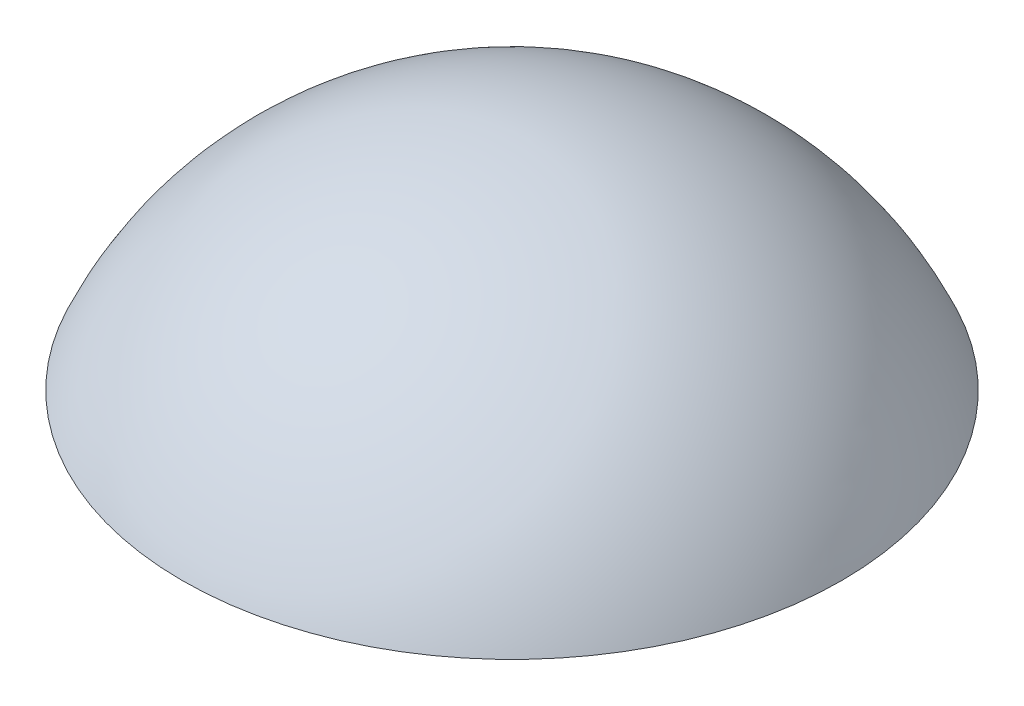
ISO-10303-21;
HEADER;
FILE_DESCRIPTION(('STEP AP214'),'2;1');
FILE_NAME('part.step','',(''),(''),'','','');
FILE_SCHEMA(('AUTOMOTIVE_DESIGN { 1 0 10303 214 1 1 1 1 }'));
ENDSEC;
DATA;
#1=APPLICATION_CONTEXT('core data for automotive mechanical design processes');
#2=APPLICATION_PROTOCOL_DEFINITION('international standard','automotive_design',2000,#1);
#3=PRODUCT_CONTEXT('',#1,'mechanical');
#4=PRODUCT('Part','Part','',(#3));
#5=PRODUCT_RELATED_PRODUCT_CATEGORY('part','',(#4));
#6=PRODUCT_DEFINITION_FORMATION('','',#4);
#7=PRODUCT_DEFINITION_CONTEXT('part definition',#1,'design');
#8=PRODUCT_DEFINITION('design','',#6,#7);
#9=PRODUCT_DEFINITION_SHAPE('','',#8);
#10=(LENGTH_UNIT() NAMED_UNIT(*) SI_UNIT(.MILLI.,.METRE.));
#11=(NAMED_UNIT(*) PLANE_ANGLE_UNIT() SI_UNIT($,.RADIAN.));
#12=(NAMED_UNIT(*) SI_UNIT($,.STERADIAN.) SOLID_ANGLE_UNIT());
#13=UNCERTAINTY_MEASURE_WITH_UNIT(LENGTH_MEASURE(1.E-05),#10,'distance_accuracy_value','');
#14=(GEOMETRIC_REPRESENTATION_CONTEXT(3) GLOBAL_UNCERTAINTY_ASSIGNED_CONTEXT((#13)) GLOBAL_UNIT_ASSIGNED_CONTEXT((#10,
#11,#12)) REPRESENTATION_CONTEXT('',''));
#15=CARTESIAN_POINT('',(0.,0.,0.));
#16=DIRECTION('',(0.,0.,1.));
#17=DIRECTION('',(1.,0.,0.));
#18=AXIS2_PLACEMENT_3D('',#15,#16,#17);
#19=CARTESIAN_POINT('',(54.1726868098907,-2.84304259014334,0.));
#20=DIRECTION('',(0.,1.,0.));
#21=DIRECTION('',(0.,0.,1.));
#22=AXIS2_PLACEMENT_3D('',#19,#20,#21);
#23=CONICAL_SURFACE('',#22,51.4725104006158,0.539621947760102);
#24=CARTESIAN_POINT('',(54.1726868098907,-2.84304259014334,0.));
#25=DIRECTION('',(0.,-1.,0.));
#26=DIRECTION('',(0.,0.,-1.));
#27=AXIS2_PLACEMENT_3D('',#24,#25,#26);
#28=CIRCLE('',#27,51.4725104006158);
#29=CARTESIAN_POINT('',(54.1726868098907,-2.84304259014334,-51.4725104006158));
#30=VERTEX_POINT('',#29);
#31=EDGE_CURVE('E71',#30,#30,#28,.T.);
#32=ORIENTED_EDGE('',*,*,#31,.T.);
#33=EDGE_LOOP('',(#32));
#34=FACE_BOUND('',#33,.T.);
#35=CARTESIAN_POINT('',(54.1726868098907,-17.3572088768475,0.));
#36=DIRECTION('',(0.,-1.,0.));
#37=DIRECTION('',(0.,0.,-1.));
#38=AXIS2_PLACEMENT_3D('',#35,#36,#37);
#39=CIRCLE('',#38,42.7797462032344);
#40=CARTESIAN_POINT('',(54.1726868098907,-17.3572088768475,-42.7797462032344));
#41=VERTEX_POINT('',#40);
#42=EDGE_CURVE('E43',#41,#41,#39,.T.);
#43=ORIENTED_EDGE('',*,*,#42,.F.);
#44=EDGE_LOOP('',(#43));
#45=FACE_BOUND('',#44,.T.);
#46=CARTESIAN_POINT('',(50.1943861607327,-14.6285887963775,44.2354266142122));
#47=CARTESIAN_POINT('',(50.3097102289755,-14.7303805737194,44.1845874754076));
#48=CARTESIAN_POINT('',(50.4295581104935,-14.8282850080756,44.1360802613475));
#49=CARTESIAN_POINT('',(50.6777370951278,-15.015392328692,44.0440132010948));
#50=CARTESIAN_POINT('',(50.8060724284454,-15.1045908201811,44.0004558517961));
#51=CARTESIAN_POINT('',(51.0707535976682,-15.2735248438646,43.9184792980798));
#52=CARTESIAN_POINT('',(51.2071136140074,-15.3532428237323,43.8800696079163));
#53=CARTESIAN_POINT('',(51.4868099424113,-15.5021882836865,43.8087047430353));
#54=CARTESIAN_POINT('',(51.6301459615099,-15.571416203815,43.7757493395135));
#55=CARTESIAN_POINT('',(51.9231379176194,-15.6987491060232,43.7154219097633));
#56=CARTESIAN_POINT('',(52.0728049095535,-15.7568335611683,43.6880601814566));
#57=CARTESIAN_POINT('',(52.3771731855339,-15.8610652446636,43.6391489224029));
#58=CARTESIAN_POINT('',(52.5318746712677,-15.9072119941119,43.6175996248303));
#59=CARTESIAN_POINT('',(52.8450757563845,-15.987004146808,43.580444852888));
#60=CARTESIAN_POINT('',(53.0035731640945,-16.0206565871609,43.5648360325696));
#61=CARTESIAN_POINT('',(53.3232310829,-16.0750946179223,43.5396311232699));
#62=CARTESIAN_POINT('',(53.4843914810625,-16.0958807525391,43.5300347799777));
#63=CARTESIAN_POINT('',(53.8016335379098,-16.123768660122,43.517168357981));
#64=CARTESIAN_POINT('',(53.9576606258622,-16.1313843399289,43.5136606798553));
#65=CARTESIAN_POINT('',(54.2699175429253,-16.1344449284366,43.5122504516377));
#66=CARTESIAN_POINT('',(54.4261474247245,-16.1298854650543,43.5143499150653));
#67=CARTESIAN_POINT('',(54.7375359994027,-16.1086417812853,43.5241458855748));
#68=CARTESIAN_POINT('',(54.8926951174843,-16.0919626910515,43.5318400244707));
#69=CARTESIAN_POINT('',(55.2009380038593,-16.0466631257936,43.5527882477564));
#70=CARTESIAN_POINT('',(55.3540209823743,-16.0180382311579,43.5660443899408));
#71=CARTESIAN_POINT('',(55.6546446506522,-15.9496894977161,43.597805268851));
#72=CARTESIAN_POINT('',(55.8022342786232,-15.9101418455665,43.6162267538194));
#73=CARTESIAN_POINT('',(56.0933500115546,-15.8201733683185,43.6583129075208));
#74=CARTESIAN_POINT('',(56.2368746469779,-15.7697486664093,43.6819794457845));
#75=CARTESIAN_POINT('',(56.5188352793256,-15.6585721053905,43.7344239836342));
#76=CARTESIAN_POINT('',(56.6572731081495,-15.5978240092435,43.7632001209));
#77=CARTESIAN_POINT('',(56.9283315667689,-15.4665676976935,43.8257356654552));
#78=CARTESIAN_POINT('',(57.060949987136,-15.3960558168253,43.8594969445559));
#79=CARTESIAN_POINT('',(57.3234037724773,-15.2437400082431,43.9328944685544));
#80=CARTESIAN_POINT('',(57.453040605827,-15.1616636435929,43.9726750169303));
#81=CARTESIAN_POINT('',(57.7046487032284,-14.9886608179935,44.0571281210593));
#82=CARTESIAN_POINT('',(57.8266171670741,-14.897731154683,44.1018024476965));
#83=CARTESIAN_POINT('',(58.0622331032731,-14.7078962618428,44.1957825338063));
#84=CARTESIAN_POINT('',(58.17588211466,-14.6089925146063,44.2450874327867));
#85=CARTESIAN_POINT('',(58.3944522008334,-14.4040116104228,44.3480898378884));
#86=CARTESIAN_POINT('',(58.4993699660648,-14.297931760765,44.4017889944827));
#87=CARTESIAN_POINT('',(58.7074046377777,-14.0714923210872,44.5173622689154));
#88=CARTESIAN_POINT('',(58.809830622757,-13.9506556344217,44.5795470029824));
#89=CARTESIAN_POINT('',(59.0038636521975,-13.7027510384621,44.7082772011882));
#90=CARTESIAN_POINT('',(59.0954666932787,-13.5756808478536,44.774824264878));
#91=CARTESIAN_POINT('',(59.3536666800254,-13.1866382781313,44.9804404148254));
#92=CARTESIAN_POINT('',(59.5037683858134,-12.9167084282864,45.1255481970011));
#93=CARTESIAN_POINT('',(59.7732514593767,-12.3326858606396,45.4453740384899));
#94=CARTESIAN_POINT('',(59.8873788142852,-12.0170155556635,45.621591182024));
#95=CARTESIAN_POINT('',(60.0610993268919,-11.3774986019125,45.9856618879879));
#96=CARTESIAN_POINT('',(60.1206674050928,-11.0536482632004,46.1735207595024));
#97=CARTESIAN_POINT('',(60.1906919777738,-10.3646380756628,46.5805688862349));
#98=CARTESIAN_POINT('',(60.1941246923318,-9.99934639848907,46.8007502720457));
#99=CARTESIAN_POINT('',(60.135769414716,-9.27609495909458,47.2448527971743));
#100=CARTESIAN_POINT('',(60.0739301730551,-8.9181411834821,47.4687767390731));
#101=CARTESIAN_POINT('',(59.8785581183823,-8.18779333723039,47.9332180713927));
#102=CARTESIAN_POINT('',(59.739373678085,-7.81676144475429,48.173526486968));
#103=CARTESIAN_POINT('',(59.3871674786406,-7.10343856425008,48.6426061044286));
#104=CARTESIAN_POINT('',(59.1741881724159,-6.76113119183564,48.8713838532188));
#105=CARTESIAN_POINT('',(58.7244754538948,-6.1806942458942,49.2641737718168));
#106=CARTESIAN_POINT('',(58.5005428855785,-5.93528564764153,49.4320997915819));
#107=CARTESIAN_POINT('',(58.0071658104212,-5.47919456185547,49.7467847632335));
#108=CARTESIAN_POINT('',(57.737781137816,-5.26846713047169,49.8935710790488));
#109=CARTESIAN_POINT('',(57.2040158361979,-4.92181436490542,50.1365648985591));
#110=CARTESIAN_POINT('',(56.945950214901,-4.77929709183036,50.2371158906827));
#111=CARTESIAN_POINT('',(56.5400492250959,-4.5934303105165,50.3687602924635));
#112=CARTESIAN_POINT('',(56.4015637813592,-4.53611118771361,50.4094555407735));
#113=CARTESIAN_POINT('',(56.1190605340852,-4.43150648033746,50.4838485565238));
#114=CARTESIAN_POINT('',(55.975045115136,-4.38421662715908,50.517549300797));
#115=CARTESIAN_POINT('',(55.6814862694776,-4.30009586019586,50.5775751943309));
#116=CARTESIAN_POINT('',(55.5319142043038,-4.26333131710409,50.6038535258683));
#117=CARTESIAN_POINT('',(55.2292132462205,-4.20124776822722,50.6482688543211));
#118=CARTESIAN_POINT('',(55.0760843291314,-4.17592884027394,50.6664057958739));
#119=CARTESIAN_POINT('',(54.7676253550093,-4.13718913189382,50.6941696610689));
#120=CARTESIAN_POINT('',(54.6122962268499,-4.12376347408734,50.7038000731981));
#121=CARTESIAN_POINT('',(54.3007757043775,-4.10903957259005,50.714362178015));
#122=CARTESIAN_POINT('',(54.1445843911142,-4.10774020775948,50.7152946748708));
#123=CARTESIAN_POINT('',(53.8487771833764,-4.11679668847844,50.7087975507795));
#124=CARTESIAN_POINT('',(53.7091042669551,-4.12597080898672,50.7022157645835));
#125=CARTESIAN_POINT('',(53.4311815357797,-4.15396661723757,50.682144039426));
#126=CARTESIAN_POINT('',(53.2929322122072,-4.172791528053,50.6686517925804));
#127=CARTESIAN_POINT('',(53.0189299881807,-4.21981136725846,50.6349849400049));
#128=CARTESIAN_POINT('',(52.8831760640225,-4.24800235852283,50.614813142103));
#129=CARTESIAN_POINT('',(52.6149262344733,-4.31338420601296,50.5680911342768));
#130=CARTESIAN_POINT('',(52.4824316053036,-4.35057852771242,50.54153846832));
#131=CARTESIAN_POINT('',(52.2209172793737,-4.43368428293112,50.4823064004322));
#132=CARTESIAN_POINT('',(52.0919162036401,-4.47963472937616,50.4495995872141));
#133=CARTESIAN_POINT('',(51.8386537816354,-4.57960670690343,50.3785787528132));
#134=CARTESIAN_POINT('',(51.7143941169373,-4.63363106866176,50.3402627651774));
#135=CARTESIAN_POINT('',(51.349616621486,-4.80695805786889,50.2176065290279));
#136=CARTESIAN_POINT('',(51.1169436024277,-4.93756523901953,50.1255217604198));
#137=CARTESIAN_POINT('',(50.6490194882102,-5.24168114464004,49.9123497963717));
#138=CARTESIAN_POINT('',(50.4169262942486,-5.41848179257088,49.7890937743143));
#139=CARTESIAN_POINT('',(49.9854868025268,-5.79811843181725,49.5264932273545));
#140=CARTESIAN_POINT('',(49.7861596440814,-6.000969517385,49.3871393797247));
#141=CARTESIAN_POINT('',(49.3888676550244,-6.46555963161717,49.0708328635629));
#142=CARTESIAN_POINT('',(49.1974578026363,-6.73135413248536,48.8916023945326));
#143=CARTESIAN_POINT('',(48.8623228682458,-7.28488652157136,48.5228545324294));
#144=CARTESIAN_POINT('',(48.7186291201309,-7.57263867689403,48.3333304744899));
#145=CARTESIAN_POINT('',(48.4600127627926,-8.21252065717332,47.917598395206));
#146=CARTESIAN_POINT('',(48.3535626492558,-8.56751232720658,47.6904347648169));
#147=CARTESIAN_POINT('',(48.2438237348469,-9.10959548364924,47.3496509134649));
#148=CARTESIAN_POINT('',(48.2155649219339,-9.29199826929291,47.2359836280193));
#149=CARTESIAN_POINT('',(48.1758953499052,-9.65913430619259,47.0093078161));
#150=CARTESIAN_POINT('',(48.1644868721117,-9.84386786959247,46.8962993808889));
#151=CARTESIAN_POINT('',(48.158592219197,-10.2278023804978,46.6637072830433));
#152=CARTESIAN_POINT('',(48.165379222327,-10.4270901667021,46.5442337633822));
#153=CARTESIAN_POINT('',(48.1989569105101,-10.8254867946431,46.3079823361556));
#154=CARTESIAN_POINT('',(48.2257396083408,-11.0245956760565,46.1912033714538));
#155=CARTESIAN_POINT('',(48.2996845285875,-11.4213705481185,45.9611064733681));
#156=CARTESIAN_POINT('',(48.3468712677185,-11.6190345111357,45.8477928797755));
#157=CARTESIAN_POINT('',(48.4618932788027,-12.0108047139157,45.6258034091815));
#158=CARTESIAN_POINT('',(48.5297168341389,-12.2049129063508,45.5171249403899));
#159=CARTESIAN_POINT('',(48.6821442576029,-12.5777799686883,45.3108169020349));
#160=CARTESIAN_POINT('',(48.7656963089099,-12.7568129725925,45.2129066153604));
#161=CARTESIAN_POINT('',(48.9515709063138,-13.1081916040552,45.0228983028746));
#162=CARTESIAN_POINT('',(49.0538973336269,-13.2805358399067,44.9308014841792));
#163=CARTESIAN_POINT('',(49.2766532060452,-13.61578617998,44.7536403788634));
#164=CARTESIAN_POINT('',(49.3970099434091,-13.7787267067205,44.6685498826706));
#165=CARTESIAN_POINT('',(49.65557901147,-14.0936463016925,44.5058626648905));
#166=CARTESIAN_POINT('',(49.7937734310682,-14.2456361303244,44.4282585608661));
#167=CARTESIAN_POINT('',(49.9814363061244,-14.4316630358651,44.3342443162801));
#168=CARTESIAN_POINT('',(50.0231057600891,-14.4717963953783,44.314023613189));
#169=CARTESIAN_POINT('',(50.1077628055963,-14.5510017541834,44.2742327747771));
#170=CARTESIAN_POINT('',(50.1507506548672,-14.5900735431009,44.2546627682372));
#171=CARTESIAN_POINT('',(50.1943861607327,-14.6285887963775,44.2354266142122));
#172=B_SPLINE_CURVE_WITH_KNOTS('',3,(#46,#47,#48,#49,#50,#51,#52,#53,#54,#55,#56,#57,#58,#59,
#60,#61,#62,#63,#64,#65,#66,#67,#68,#69,#70,#71,#72,#73,#74,#75,#76,#77,#78,#79,#80,#81,#82,#83,
#84,#85,#86,#87,#88,#89,#90,#91,#92,#93,#94,#95,#96,#97,#98,#99,#100,#101,#102,#103,#104,#105,
#106,#107,#108,#109,#110,#111,#112,#113,#114,#115,#116,#117,#118,#119,#120,#121,#122,#123,#124,
#125,#126,#127,#128,#129,#130,#131,#132,#133,#134,#135,#136,#137,#138,#139,#140,#141,#142,#143,
#144,#145,#146,#147,#148,#149,#150,#151,#152,#153,#154,#155,#156,#157,#158,#159,#160,#161,#162,
#163,#164,#165,#166,#167,#168,#169,#170,#171),.UNSPECIFIED.,.T.,.F.,(4,2,2,2,2,2,2,2,2,2,2,2,2,
2,2,2,2,2,2,2,2,2,2,2,2,2,2,2,2,2,2,2,2,2,2,2,2,2,2,2,2,2,2,2,2,2,2,2,2,2,2,2,2,2,2,2,2,2,2,2,2,
2,4),(0.,0.485963028214807,0.972170115989994,1.45926380348525,1.94633705248418,2.43429908173083,
2.92228068339186,3.40998702325354,3.89767273310657,4.36585952584887,4.83421446665523,
5.30237127150303,5.77070143497253,6.23187897532013,6.69322116150959,7.15439554395001,
7.61574352965649,8.09074560348966,8.56592013503968,9.04100653970437,9.51627221204861,
10.026242050894,10.536399939623,11.5561782810606,12.6890668472681,13.8224759122586,
15.0967474044734,16.3720201593713,17.755784117574,19.1387533381638,20.2511351422486,
21.3620638451808,22.2922685650098,22.7576942500067,23.2229214436496,23.6910207222172,
24.1591231838788,24.6270335897199,25.0949007343467,25.5147820235974,25.9348036319732,
26.3546489029839,26.7746560344115,27.1965802181997,27.618652675122,28.4622970110606,
29.4090109538556,30.3562759416729,31.4721148281879,32.5886850138376,33.8867388709335,
34.5365237556739,35.1863966050006,35.8829073371897,36.5791399989372,37.276211561991,
37.9728880966285,38.6334589447675,39.2941665065313,39.9522781005112,40.6097339414107,
40.7935730273625,40.9774482833363),.UNSPECIFIED.);
#173=CARTESIAN_POINT('',(50.1943861607327,-14.6285887963775,44.2354266142122));
#174=VERTEX_POINT('',#173);
#175=EDGE_CURVE('E11',#174,#174,#172,.T.);
#176=ORIENTED_EDGE('',*,*,#175,.F.);
#177=EDGE_LOOP('',(#176));
#178=FACE_BOUND('',#177,.T.);
#179=ADVANCED_FACE('F33',(#34,#45,#178),#23,.T.);
#180=CARTESIAN_POINT('',(54.1726868098907,-17.3572088768475,0.));
#181=DIRECTION('',(0.,1.,0.));
#182=DIRECTION('',(0.,0.,1.));
#183=AXIS2_PLACEMENT_3D('',#180,#181,#182);
#184=PLANE('',#183);
#185=ORIENTED_EDGE('',*,*,#42,.T.);
#186=EDGE_LOOP('',(#185));
#187=FACE_BOUND('',#186,.T.);
#188=ADVANCED_FACE('F35',(#187),#184,.F.);
#189=CARTESIAN_POINT('',(2.70017640927496,-2.84304259014334,0.));
#190=DIRECTION('',(0.,1.,0.));
#191=DIRECTION('',(0.,0.,1.));
#192=AXIS2_PLACEMENT_3D('',#189,#190,#191);
#193=PLANE('',#192);
#194=ORIENTED_EDGE('',*,*,#31,.F.);
#195=EDGE_LOOP('',(#194));
#196=FACE_BOUND('',#195,.T.);
#197=CARTESIAN_POINT('',(54.1726868098907,-2.84304259014334,0.));
#198=DIRECTION('',(0.,-1.,0.));
#199=DIRECTION('',(0.,0.,-1.));
#200=AXIS2_PLACEMENT_3D('',#197,#198,#199);
#201=CIRCLE('',#200,73.025);
#202=CARTESIAN_POINT('',(54.1726868098907,-2.84304259014334,-73.025));
#203=VERTEX_POINT('',#202);
#204=EDGE_CURVE('E77',#203,#203,#201,.T.);
#205=ORIENTED_EDGE('',*,*,#204,.T.);
#206=EDGE_LOOP('',(#205));
#207=FACE_BOUND('',#206,.T.);
#208=ADVANCED_FACE('F49',(#196,#207),#193,.F.);
#209=CARTESIAN_POINT('',(54.1726868098907,-34.1591031673673,-0.185506618479096));
#210=DIRECTION('',(-1.,0.,0.));
#211=DIRECTION('',(0.,0.,-1.));
#212=AXIS2_PLACEMENT_3D('',#209,#210,#211);
#213=CIRCLE('',#212,79.2861113067919);
#214=TRIMMED_CURVE('',#213,(PARAMETER_VALUE(-1.57313604032951)),
(PARAMETER_VALUE(1.57313604032951)),.T.,.PARAMETER.);
#215=CARTESIAN_POINT('',(54.1726868098907,-34.1591031673673,0.));
#216=DIRECTION('',(0.,-1.,0.));
#217=AXIS1_PLACEMENT('',#215,#216);
#218=SURFACE_OF_REVOLUTION('',#214,#217);
#219=ORIENTED_EDGE('',*,*,#204,.F.);
#220=EDGE_LOOP('',(#219));
#221=FACE_BOUND('',#220,.T.);
#222=CARTESIAN_POINT('',(54.1726868098907,45.1267911231525,0.));
#223=VERTEX_POINT('',#222);
#224=VERTEX_LOOP('',#223);
#225=FACE_BOUND('',#224,.T.);
#226=ADVANCED_FACE('F46',(#221,#225),#218,.T.);
#227=CARTESIAN_POINT('',(54.1726868098907,-10.1214499350717,56.896));
#228=DIRECTION('',(0.,0.,-1.));
#229=DIRECTION('',(-1.,0.,0.));
#230=AXIS2_PLACEMENT_3D('',#227,#228,#229);
#231=CYLINDRICAL_SURFACE('',#230,6.01175321933499);
#232=CARTESIAN_POINT('',(54.1726868098907,-10.1214499350717,56.896));
#233=DIRECTION('',(0.,0.,1.));
#234=DIRECTION('',(1.,0.,0.));
#235=AXIS2_PLACEMENT_3D('',#232,#233,#234);
#236=CIRCLE('',#235,6.01175321933499);
#237=CARTESIAN_POINT('',(60.1844400292257,-10.1214499350717,56.896));
#238=VERTEX_POINT('',#237);
#239=EDGE_CURVE('E82',#238,#238,#236,.T.);
#240=ORIENTED_EDGE('',*,*,#239,.F.);
#241=EDGE_LOOP('',(#240));
#242=FACE_BOUND('',#241,.T.);
#243=ORIENTED_EDGE('',*,*,#175,.T.);
#244=EDGE_LOOP('',(#243));
#245=FACE_BOUND('',#244,.T.);
#246=ADVANCED_FACE('F48',(#242,#245),#231,.T.);
#247=CARTESIAN_POINT('',(54.1726868098907,-10.1214499350717,56.896));
#248=DIRECTION('',(0.,0.,1.));
#249=DIRECTION('',(1.,0.,0.));
#250=AXIS2_PLACEMENT_3D('',#247,#248,#249);
#251=PLANE('',#250);
#252=ORIENTED_EDGE('',*,*,#239,.T.);
#253=EDGE_LOOP('',(#252));
#254=FACE_BOUND('',#253,.T.);
#255=ADVANCED_FACE('F56',(#254),#251,.T.);
#256=CLOSED_SHELL('',(#179,#188,#208,#226,#246,#255));
#257=MANIFOLD_SOLID_BREP('B2',#256);
#258=ADVANCED_BREP_SHAPE_REPRESENTATION('',(#18,#257),#14);
#259=SHAPE_DEFINITION_REPRESENTATION(#9,#258);
ENDSEC;
END-ISO-10303-21;
